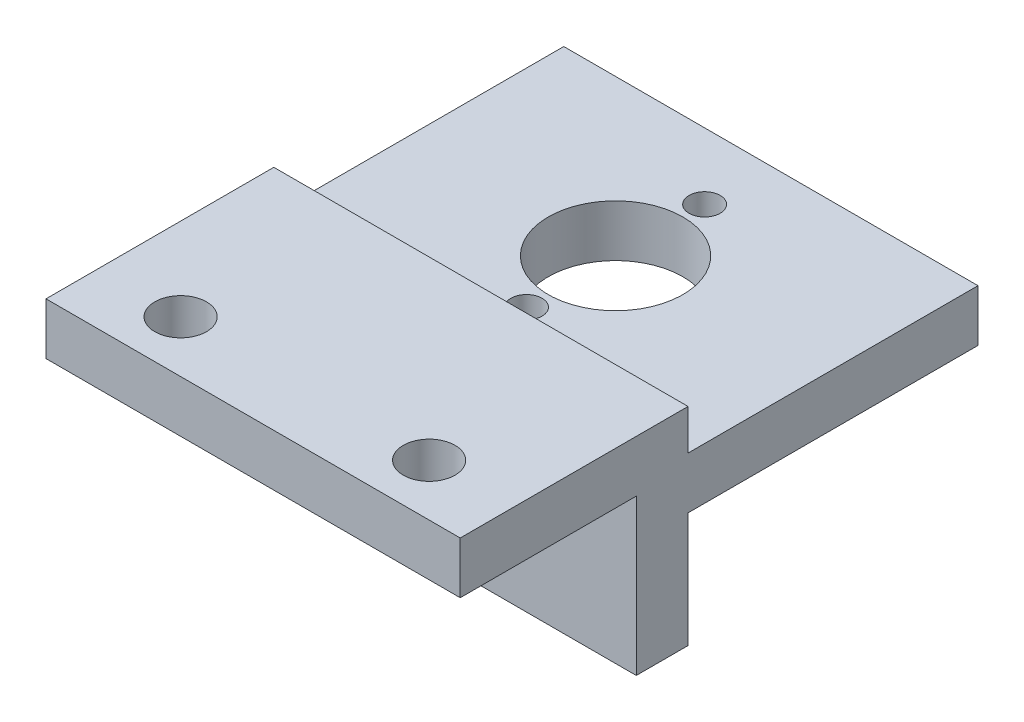
ISO-10303-21;
HEADER;
FILE_DESCRIPTION(('STEP AP214'),'2;1');
FILE_NAME('part.step','',(''),(''),'','','');
FILE_SCHEMA(('AUTOMOTIVE_DESIGN { 1 0 10303 214 1 1 1 1 }'));
ENDSEC;
DATA;
#1=APPLICATION_CONTEXT('core data for automotive mechanical design processes');
#2=APPLICATION_PROTOCOL_DEFINITION('international standard','automotive_design',2000,#1);
#3=PRODUCT_CONTEXT('',#1,'mechanical');
#4=PRODUCT('Part','Part','',(#3));
#5=PRODUCT_RELATED_PRODUCT_CATEGORY('part','',(#4));
#6=PRODUCT_DEFINITION_FORMATION('','',#4);
#7=PRODUCT_DEFINITION_CONTEXT('part definition',#1,'design');
#8=PRODUCT_DEFINITION('design','',#6,#7);
#9=PRODUCT_DEFINITION_SHAPE('','',#8);
#10=(LENGTH_UNIT() NAMED_UNIT(*) SI_UNIT(.MILLI.,.METRE.));
#11=(NAMED_UNIT(*) PLANE_ANGLE_UNIT() SI_UNIT($,.RADIAN.));
#12=(NAMED_UNIT(*) SI_UNIT($,.STERADIAN.) SOLID_ANGLE_UNIT());
#13=UNCERTAINTY_MEASURE_WITH_UNIT(LENGTH_MEASURE(1.E-05),#10,'distance_accuracy_value','');
#14=(GEOMETRIC_REPRESENTATION_CONTEXT(3) GLOBAL_UNCERTAINTY_ASSIGNED_CONTEXT((#13)) GLOBAL_UNIT_ASSIGNED_CONTEXT((#10,
#11,#12)) REPRESENTATION_CONTEXT('',''));
#15=CARTESIAN_POINT('',(0.,0.,0.));
#16=DIRECTION('',(0.,0.,1.));
#17=DIRECTION('',(1.,0.,0.));
#18=AXIS2_PLACEMENT_3D('',#15,#16,#17);
#19=CARTESIAN_POINT('',(0.,0.,0.));
#20=DIRECTION('',(0.,1.,0.));
#21=DIRECTION('',(0.,0.,1.));
#22=AXIS2_PLACEMENT_3D('',#19,#20,#21);
#23=PLANE('',#22);
#24=CARTESIAN_POINT('',(-12.,0.,30.));
#25=DIRECTION('',(0.,1.,0.));
#26=DIRECTION('',(0.,0.,1.));
#27=AXIS2_PLACEMENT_3D('',#24,#25,#26);
#28=CIRCLE('',#27,2.5);
#29=CARTESIAN_POINT('',(-12.,0.,32.5));
#30=VERTEX_POINT('',#29);
#31=EDGE_CURVE('E221',#30,#30,#28,.T.);
#32=ORIENTED_EDGE('',*,*,#31,.T.);
#33=EDGE_LOOP('',(#32));
#34=FACE_BOUND('',#33,.T.);
#35=CARTESIAN_POINT('',(12.,0.,30.));
#36=DIRECTION('',(0.,1.,0.));
#37=DIRECTION('',(0.,0.,1.));
#38=AXIS2_PLACEMENT_3D('',#35,#36,#37);
#39=CIRCLE('',#38,2.5);
#40=CARTESIAN_POINT('',(12.,0.,32.5));
#41=VERTEX_POINT('',#40);
#42=EDGE_CURVE('E225',#41,#41,#39,.T.);
#43=ORIENTED_EDGE('',*,*,#42,.T.);
#44=EDGE_LOOP('',(#43));
#45=FACE_BOUND('',#44,.T.);
#46=DIRECTION('',(-1.,0.,0.));
#47=VECTOR('',#46,1.);
#48=CARTESIAN_POINT('',(20.,0.,18.));
#49=LINE('',#48,#47);
#50=CARTESIAN_POINT('',(20.,0.,18.));
#51=VERTEX_POINT('',#50);
#52=CARTESIAN_POINT('',(-20.,0.,18.));
#53=VERTEX_POINT('',#52);
#54=EDGE_CURVE('E212',#51,#53,#49,.T.);
#55=ORIENTED_EDGE('',*,*,#54,.F.);
#56=DIRECTION('',(0.,0.,-1.));
#57=VECTOR('',#56,1.);
#58=CARTESIAN_POINT('',(20.,0.,-15.));
#59=LINE('',#58,#57);
#60=CARTESIAN_POINT('',(20.,0.,35.));
#61=VERTEX_POINT('',#60);
#62=EDGE_CURVE('E141',#61,#51,#59,.T.);
#63=ORIENTED_EDGE('',*,*,#62,.F.);
#64=DIRECTION('',(1.,0.,0.));
#65=VECTOR('',#64,1.);
#66=CARTESIAN_POINT('',(-20.,0.,35.));
#67=LINE('',#66,#65);
#68=CARTESIAN_POINT('',(-20.,0.,35.));
#69=VERTEX_POINT('',#68);
#70=EDGE_CURVE('E200',#69,#61,#67,.T.);
#71=ORIENTED_EDGE('',*,*,#70,.F.);
#72=DIRECTION('',(0.,0.,1.));
#73=VECTOR('',#72,1.);
#74=CARTESIAN_POINT('',(-20.,0.,-15.));
#75=LINE('',#74,#73);
#76=EDGE_CURVE('E206',#53,#69,#75,.T.);
#77=ORIENTED_EDGE('',*,*,#76,.F.);
#78=EDGE_LOOP('',(#55,#63,#71,#77));
#79=FACE_BOUND('',#78,.T.);
#80=ADVANCED_FACE('F32',(#34,#45,#79),#23,.F.);
#81=CARTESIAN_POINT('',(-20.,5.,-15.));
#82=DIRECTION('',(1.,0.,0.));
#83=DIRECTION('',(0.,0.,-1.));
#84=AXIS2_PLACEMENT_3D('',#81,#82,#83);
#85=PLANE('',#84);
#86=DIRECTION('',(0.,0.,1.));
#87=VECTOR('',#86,1.);
#88=CARTESIAN_POINT('',(-20.,5.,-15.));
#89=LINE('',#88,#87);
#90=CARTESIAN_POINT('',(-20.,5.,13.));
#91=VERTEX_POINT('',#90);
#92=CARTESIAN_POINT('',(-20.,5.,35.));
#93=VERTEX_POINT('',#92);
#94=EDGE_CURVE('E213',#91,#93,#89,.T.);
#95=ORIENTED_EDGE('',*,*,#94,.F.);
#96=DIRECTION('',(0.,1.,0.));
#97=VECTOR('',#96,1.);
#98=CARTESIAN_POINT('',(-20.,5.,13.));
#99=LINE('',#98,#97);
#100=CARTESIAN_POINT('',(-20.,1.1,13.));
#101=VERTEX_POINT('',#100);
#102=EDGE_CURVE('E49',#101,#91,#99,.T.);
#103=ORIENTED_EDGE('',*,*,#102,.F.);
#104=DIRECTION('',(0.,0.,1.));
#105=VECTOR('',#104,1.);
#106=CARTESIAN_POINT('',(-20.,1.1,-15.));
#107=LINE('',#106,#105);
#108=CARTESIAN_POINT('',(-20.,1.1,-15.));
#109=VERTEX_POINT('',#108);
#110=EDGE_CURVE('E116',#109,#101,#107,.T.);
#111=ORIENTED_EDGE('',*,*,#110,.F.);
#112=DIRECTION('',(0.,-1.,0.));
#113=VECTOR('',#112,1.);
#114=CARTESIAN_POINT('',(-20.,5.,-15.));
#115=LINE('',#114,#113);
#116=CARTESIAN_POINT('',(-20.,-3.9,-15.));
#117=VERTEX_POINT('',#116);
#118=EDGE_CURVE('E127',#109,#117,#115,.T.);
#119=ORIENTED_EDGE('',*,*,#118,.T.);
#120=DIRECTION('',(0.,0.,-1.));
#121=VECTOR('',#120,1.);
#122=CARTESIAN_POINT('',(-20.,-3.9,13.));
#123=LINE('',#122,#121);
#124=CARTESIAN_POINT('',(-20.,-3.9,13.));
#125=VERTEX_POINT('',#124);
#126=EDGE_CURVE('E149',#125,#117,#123,.T.);
#127=ORIENTED_EDGE('',*,*,#126,.F.);
#128=DIRECTION('',(0.,1.,0.));
#129=VECTOR('',#128,1.);
#130=CARTESIAN_POINT('',(-20.,-15.,13.));
#131=LINE('',#130,#129);
#132=CARTESIAN_POINT('',(-20.,-15.,13.));
#133=VERTEX_POINT('',#132);
#134=EDGE_CURVE('E236',#133,#125,#131,.T.);
#135=ORIENTED_EDGE('',*,*,#134,.F.);
#136=DIRECTION('',(0.,0.,-1.));
#137=VECTOR('',#136,1.);
#138=CARTESIAN_POINT('',(-20.,-15.,18.));
#139=LINE('',#138,#137);
#140=CARTESIAN_POINT('',(-20.,-15.,18.));
#141=VERTEX_POINT('',#140);
#142=EDGE_CURVE('E247',#141,#133,#139,.T.);
#143=ORIENTED_EDGE('',*,*,#142,.F.);
#144=DIRECTION('',(0.,1.,0.));
#145=VECTOR('',#144,1.);
#146=CARTESIAN_POINT('',(-20.,-15.,18.));
#147=LINE('',#146,#145);
#148=EDGE_CURVE('E234',#141,#53,#147,.T.);
#149=ORIENTED_EDGE('',*,*,#148,.T.);
#150=ORIENTED_EDGE('',*,*,#76,.T.);
#151=DIRECTION('',(0.,-1.,0.));
#152=VECTOR('',#151,1.);
#153=CARTESIAN_POINT('',(-20.,5.,35.));
#154=LINE('',#153,#152);
#155=EDGE_CURVE('E11',#93,#69,#154,.T.);
#156=ORIENTED_EDGE('',*,*,#155,.F.);
#157=EDGE_LOOP('',(#95,#103,#111,#119,#127,#135,#143,#149,#150,#156));
#158=FACE_BOUND('',#157,.T.);
#159=ADVANCED_FACE('F34',(#158),#85,.F.);
#160=CARTESIAN_POINT('',(-20.,5.,35.));
#161=DIRECTION('',(0.,0.,-1.));
#162=DIRECTION('',(-1.,0.,0.));
#163=AXIS2_PLACEMENT_3D('',#160,#161,#162);
#164=PLANE('',#163);
#165=ORIENTED_EDGE('',*,*,#70,.T.);
#166=DIRECTION('',(0.,-1.,0.));
#167=VECTOR('',#166,1.);
#168=CARTESIAN_POINT('',(20.,5.,35.));
#169=LINE('',#168,#167);
#170=CARTESIAN_POINT('',(20.,5.,35.));
#171=VERTEX_POINT('',#170);
#172=EDGE_CURVE('E41',#171,#61,#169,.T.);
#173=ORIENTED_EDGE('',*,*,#172,.F.);
#174=DIRECTION('',(1.,0.,0.));
#175=VECTOR('',#174,1.);
#176=CARTESIAN_POINT('',(-20.,5.,35.));
#177=LINE('',#176,#175);
#178=EDGE_CURVE('E138',#93,#171,#177,.T.);
#179=ORIENTED_EDGE('',*,*,#178,.F.);
#180=ORIENTED_EDGE('',*,*,#155,.T.);
#181=EDGE_LOOP('',(#165,#173,#179,#180));
#182=FACE_BOUND('',#181,.T.);
#183=ADVANCED_FACE('F182',(#182),#164,.F.);
#184=CARTESIAN_POINT('',(20.,5.,-15.));
#185=DIRECTION('',(-1.,0.,0.));
#186=DIRECTION('',(0.,0.,1.));
#187=AXIS2_PLACEMENT_3D('',#184,#185,#186);
#188=PLANE('',#187);
#189=DIRECTION('',(0.,0.,-1.));
#190=VECTOR('',#189,1.);
#191=CARTESIAN_POINT('',(20.,1.1,-15.));
#192=LINE('',#191,#190);
#193=CARTESIAN_POINT('',(20.,1.1,13.));
#194=VERTEX_POINT('',#193);
#195=CARTESIAN_POINT('',(20.,1.1,-15.));
#196=VERTEX_POINT('',#195);
#197=EDGE_CURVE('E118',#194,#196,#192,.T.);
#198=ORIENTED_EDGE('',*,*,#197,.F.);
#199=DIRECTION('',(0.,-1.,0.));
#200=VECTOR('',#199,1.);
#201=CARTESIAN_POINT('',(20.,5.,13.));
#202=LINE('',#201,#200);
#203=CARTESIAN_POINT('',(20.,5.,13.));
#204=VERTEX_POINT('',#203);
#205=EDGE_CURVE('E262',#204,#194,#202,.T.);
#206=ORIENTED_EDGE('',*,*,#205,.F.);
#207=DIRECTION('',(0.,0.,-1.));
#208=VECTOR('',#207,1.);
#209=CARTESIAN_POINT('',(20.,5.,-15.));
#210=LINE('',#209,#208);
#211=EDGE_CURVE('E134',#171,#204,#210,.T.);
#212=ORIENTED_EDGE('',*,*,#211,.F.);
#213=ORIENTED_EDGE('',*,*,#172,.T.);
#214=ORIENTED_EDGE('',*,*,#62,.T.);
#215=DIRECTION('',(0.,1.,0.));
#216=VECTOR('',#215,1.);
#217=CARTESIAN_POINT('',(20.,-15.,18.));
#218=LINE('',#217,#216);
#219=CARTESIAN_POINT('',(20.,-15.,18.));
#220=VERTEX_POINT('',#219);
#221=EDGE_CURVE('E230',#220,#51,#218,.T.);
#222=ORIENTED_EDGE('',*,*,#221,.F.);
#223=DIRECTION('',(0.,0.,1.));
#224=VECTOR('',#223,1.);
#225=CARTESIAN_POINT('',(20.,-15.,18.));
#226=LINE('',#225,#224);
#227=CARTESIAN_POINT('',(20.,-15.,13.));
#228=VERTEX_POINT('',#227);
#229=EDGE_CURVE('E244',#228,#220,#226,.T.);
#230=ORIENTED_EDGE('',*,*,#229,.F.);
#231=DIRECTION('',(0.,1.,0.));
#232=VECTOR('',#231,1.);
#233=CARTESIAN_POINT('',(20.,-15.,13.));
#234=LINE('',#233,#232);
#235=CARTESIAN_POINT('',(20.,-3.9,13.));
#236=VERTEX_POINT('',#235);
#237=EDGE_CURVE('E239',#228,#236,#234,.T.);
#238=ORIENTED_EDGE('',*,*,#237,.T.);
#239=DIRECTION('',(0.,0.,1.));
#240=VECTOR('',#239,1.);
#241=CARTESIAN_POINT('',(20.,-3.9,13.));
#242=LINE('',#241,#240);
#243=CARTESIAN_POINT('',(20.,-3.9,-15.));
#244=VERTEX_POINT('',#243);
#245=EDGE_CURVE('E57',#244,#236,#242,.T.);
#246=ORIENTED_EDGE('',*,*,#245,.F.);
#247=DIRECTION('',(0.,-1.,0.));
#248=VECTOR('',#247,1.);
#249=CARTESIAN_POINT('',(20.,5.,-15.));
#250=LINE('',#249,#248);
#251=EDGE_CURVE('E133',#196,#244,#250,.T.);
#252=ORIENTED_EDGE('',*,*,#251,.F.);
#253=EDGE_LOOP('',(#198,#206,#212,#213,#214,#222,#230,#238,#246,#252));
#254=FACE_BOUND('',#253,.T.);
#255=ADVANCED_FACE('F191',(#254),#188,.F.);
#256=CARTESIAN_POINT('',(-20.,5.,-15.));
#257=DIRECTION('',(0.,0.,1.));
#258=DIRECTION('',(1.,0.,0.));
#259=AXIS2_PLACEMENT_3D('',#256,#257,#258);
#260=PLANE('',#259);
#261=ORIENTED_EDGE('',*,*,#118,.F.);
#262=DIRECTION('',(-1.,0.,0.));
#263=VECTOR('',#262,1.);
#264=CARTESIAN_POINT('',(48.2703024391321,1.1,-15.));
#265=LINE('',#264,#263);
#266=EDGE_CURVE('E112',#196,#109,#265,.T.);
#267=ORIENTED_EDGE('',*,*,#266,.F.);
#268=ORIENTED_EDGE('',*,*,#251,.T.);
#269=DIRECTION('',(1.,0.,0.));
#270=VECTOR('',#269,1.);
#271=CARTESIAN_POINT('',(-20.,-3.9,-15.));
#272=LINE('',#271,#270);
#273=EDGE_CURVE('E131',#117,#244,#272,.T.);
#274=ORIENTED_EDGE('',*,*,#273,.F.);
#275=EDGE_LOOP('',(#261,#267,#268,#274));
#276=FACE_BOUND('',#275,.T.);
#277=ADVANCED_FACE('F130',(#276),#260,.F.);
#278=CARTESIAN_POINT('',(0.,5.,0.));
#279=DIRECTION('',(0.,1.,0.));
#280=DIRECTION('',(0.,0.,1.));
#281=AXIS2_PLACEMENT_3D('',#278,#279,#280);
#282=PLANE('',#281);
#283=DIRECTION('',(-1.,0.,0.));
#284=VECTOR('',#283,1.);
#285=CARTESIAN_POINT('',(48.2703024391321,5.,13.));
#286=LINE('',#285,#284);
#287=EDGE_CURVE('E265',#204,#91,#286,.T.);
#288=ORIENTED_EDGE('',*,*,#287,.T.);
#289=ORIENTED_EDGE('',*,*,#94,.T.);
#290=ORIENTED_EDGE('',*,*,#178,.T.);
#291=ORIENTED_EDGE('',*,*,#211,.T.);
#292=EDGE_LOOP('',(#288,#289,#290,#291));
#293=FACE_BOUND('',#292,.T.);
#294=CARTESIAN_POINT('',(12.,5.,30.));
#295=DIRECTION('',(0.,1.,0.));
#296=DIRECTION('',(0.,0.,1.));
#297=AXIS2_PLACEMENT_3D('',#294,#295,#296);
#298=CIRCLE('',#297,2.5);
#299=CARTESIAN_POINT('',(12.,5.,32.5));
#300=VERTEX_POINT('',#299);
#301=EDGE_CURVE('E227',#300,#300,#298,.T.);
#302=ORIENTED_EDGE('',*,*,#301,.F.);
#303=EDGE_LOOP('',(#302));
#304=FACE_BOUND('',#303,.T.);
#305=CARTESIAN_POINT('',(-12.,5.,30.));
#306=DIRECTION('',(0.,1.,0.));
#307=DIRECTION('',(0.,0.,1.));
#308=AXIS2_PLACEMENT_3D('',#305,#306,#307);
#309=CIRCLE('',#308,2.5);
#310=CARTESIAN_POINT('',(-12.,5.,32.5));
#311=VERTEX_POINT('',#310);
#312=EDGE_CURVE('E218',#311,#311,#309,.T.);
#313=ORIENTED_EDGE('',*,*,#312,.F.);
#314=EDGE_LOOP('',(#313));
#315=FACE_BOUND('',#314,.T.);
#316=ADVANCED_FACE('F187',(#293,#304,#315),#282,.T.);
#317=CARTESIAN_POINT('',(-12.,0.,30.));
#318=DIRECTION('',(0.,1.,0.));
#319=DIRECTION('',(0.,0.,1.));
#320=AXIS2_PLACEMENT_3D('',#317,#318,#319);
#321=CYLINDRICAL_SURFACE('',#320,2.5);
#322=ORIENTED_EDGE('',*,*,#31,.F.);
#323=EDGE_LOOP('',(#322));
#324=FACE_BOUND('',#323,.T.);
#325=ORIENTED_EDGE('',*,*,#312,.T.);
#326=EDGE_LOOP('',(#325));
#327=FACE_BOUND('',#326,.T.);
#328=ADVANCED_FACE('F288',(#324,#327),#321,.F.);
#329=CARTESIAN_POINT('',(12.,0.,30.));
#330=DIRECTION('',(0.,1.,0.));
#331=DIRECTION('',(0.,0.,1.));
#332=AXIS2_PLACEMENT_3D('',#329,#330,#331);
#333=CYLINDRICAL_SURFACE('',#332,2.5);
#334=ORIENTED_EDGE('',*,*,#42,.F.);
#335=EDGE_LOOP('',(#334));
#336=FACE_BOUND('',#335,.T.);
#337=ORIENTED_EDGE('',*,*,#301,.T.);
#338=EDGE_LOOP('',(#337));
#339=FACE_BOUND('',#338,.T.);
#340=ADVANCED_FACE('F281',(#336,#339),#333,.F.);
#341=CARTESIAN_POINT('',(20.,-15.,18.));
#342=DIRECTION('',(0.,0.,-1.));
#343=DIRECTION('',(-1.,0.,0.));
#344=AXIS2_PLACEMENT_3D('',#341,#342,#343);
#345=PLANE('',#344);
#346=ORIENTED_EDGE('',*,*,#54,.T.);
#347=ORIENTED_EDGE('',*,*,#148,.F.);
#348=DIRECTION('',(-1.,0.,0.));
#349=VECTOR('',#348,1.);
#350=CARTESIAN_POINT('',(20.,-15.,18.));
#351=LINE('',#350,#349);
#352=EDGE_CURVE('E249',#220,#141,#351,.T.);
#353=ORIENTED_EDGE('',*,*,#352,.F.);
#354=ORIENTED_EDGE('',*,*,#221,.T.);
#355=EDGE_LOOP('',(#346,#347,#353,#354));
#356=FACE_BOUND('',#355,.T.);
#357=ADVANCED_FACE('F279',(#356),#345,.F.);
#358=CARTESIAN_POINT('',(20.,-15.,13.));
#359=DIRECTION('',(0.,0.,1.));
#360=DIRECTION('',(1.,0.,0.));
#361=AXIS2_PLACEMENT_3D('',#358,#359,#360);
#362=PLANE('',#361);
#363=ORIENTED_EDGE('',*,*,#134,.T.);
#364=DIRECTION('',(-1.,0.,0.));
#365=VECTOR('',#364,1.);
#366=CARTESIAN_POINT('',(-20.,-3.9,13.));
#367=LINE('',#366,#365);
#368=EDGE_CURVE('E245',#236,#125,#367,.T.);
#369=ORIENTED_EDGE('',*,*,#368,.F.);
#370=ORIENTED_EDGE('',*,*,#237,.F.);
#371=DIRECTION('',(1.,0.,0.));
#372=VECTOR('',#371,1.);
#373=CARTESIAN_POINT('',(20.,-15.,13.));
#374=LINE('',#373,#372);
#375=EDGE_CURVE('E242',#133,#228,#374,.T.);
#376=ORIENTED_EDGE('',*,*,#375,.F.);
#377=EDGE_LOOP('',(#363,#369,#370,#376));
#378=FACE_BOUND('',#377,.T.);
#379=ADVANCED_FACE('F272',(#378),#362,.F.);
#380=CARTESIAN_POINT('',(0.,-15.,0.));
#381=DIRECTION('',(0.,1.,0.));
#382=DIRECTION('',(0.,0.,1.));
#383=AXIS2_PLACEMENT_3D('',#380,#381,#382);
#384=PLANE('',#383);
#385=ORIENTED_EDGE('',*,*,#229,.T.);
#386=ORIENTED_EDGE('',*,*,#352,.T.);
#387=ORIENTED_EDGE('',*,*,#142,.T.);
#388=ORIENTED_EDGE('',*,*,#375,.T.);
#389=EDGE_LOOP('',(#385,#386,#387,#388));
#390=FACE_BOUND('',#389,.T.);
#391=ADVANCED_FACE('F276',(#390),#384,.F.);
#392=CARTESIAN_POINT('',(0.,-3.9,0.));
#393=DIRECTION('',(0.,-1.,0.));
#394=DIRECTION('',(0.,0.,-1.));
#395=AXIS2_PLACEMENT_3D('',#392,#393,#394);
#396=PLANE('',#395);
#397=CARTESIAN_POINT('',(0.,-3.9,-8.6));
#398=DIRECTION('',(0.,-1.,0.));
#399=DIRECTION('',(0.,0.,-1.));
#400=AXIS2_PLACEMENT_3D('',#397,#398,#399);
#401=CIRCLE('',#400,1.5);
#402=CARTESIAN_POINT('',(0.,-3.9,-10.1));
#403=VERTEX_POINT('',#402);
#404=EDGE_CURVE('E150',#403,#403,#401,.F.);
#405=ORIENTED_EDGE('',*,*,#404,.T.);
#406=EDGE_LOOP('',(#405));
#407=FACE_BOUND('',#406,.T.);
#408=CARTESIAN_POINT('',(0.,-3.9,8.6));
#409=DIRECTION('',(0.,-1.,0.));
#410=DIRECTION('',(0.,0.,-1.));
#411=AXIS2_PLACEMENT_3D('',#408,#409,#410);
#412=CIRCLE('',#411,1.5);
#413=CARTESIAN_POINT('',(0.,-3.9,7.1));
#414=VERTEX_POINT('',#413);
#415=EDGE_CURVE('E151',#414,#414,#412,.F.);
#416=ORIENTED_EDGE('',*,*,#415,.T.);
#417=EDGE_LOOP('',(#416));
#418=FACE_BOUND('',#417,.T.);
#419=CARTESIAN_POINT('',(0.,-3.9,0.));
#420=DIRECTION('',(0.,-1.,0.));
#421=DIRECTION('',(0.,0.,-1.));
#422=AXIS2_PLACEMENT_3D('',#419,#420,#421);
#423=CIRCLE('',#422,6.5);
#424=CARTESIAN_POINT('',(0.,-3.9,-6.5));
#425=VERTEX_POINT('',#424);
#426=EDGE_CURVE('E146',#425,#425,#423,.F.);
#427=ORIENTED_EDGE('',*,*,#426,.T.);
#428=EDGE_LOOP('',(#427));
#429=FACE_BOUND('',#428,.T.);
#430=ORIENTED_EDGE('',*,*,#126,.T.);
#431=ORIENTED_EDGE('',*,*,#273,.T.);
#432=ORIENTED_EDGE('',*,*,#245,.T.);
#433=ORIENTED_EDGE('',*,*,#368,.T.);
#434=EDGE_LOOP('',(#430,#431,#432,#433));
#435=FACE_BOUND('',#434,.T.);
#436=ADVANCED_FACE('F157',(#407,#418,#429,#435),#396,.T.);
#437=CARTESIAN_POINT('',(0.,5.,0.));
#438=DIRECTION('',(0.,-1.,0.));
#439=DIRECTION('',(0.,0.,-1.));
#440=AXIS2_PLACEMENT_3D('',#437,#438,#439);
#441=CYLINDRICAL_SURFACE('',#440,6.5);
#442=CARTESIAN_POINT('',(0.,1.1,0.));
#443=DIRECTION('',(0.,-1.,0.));
#444=DIRECTION('',(0.,0.,-1.));
#445=AXIS2_PLACEMENT_3D('',#442,#443,#444);
#446=CIRCLE('',#445,6.5);
#447=CARTESIAN_POINT('',(0.,1.1,-6.5));
#448=VERTEX_POINT('',#447);
#449=EDGE_CURVE('E153',#448,#448,#446,.T.);
#450=ORIENTED_EDGE('',*,*,#449,.F.);
#451=EDGE_LOOP('',(#450));
#452=FACE_BOUND('',#451,.T.);
#453=ORIENTED_EDGE('',*,*,#426,.F.);
#454=EDGE_LOOP('',(#453));
#455=FACE_BOUND('',#454,.T.);
#456=ADVANCED_FACE('F171',(#452,#455),#441,.F.);
#457=CARTESIAN_POINT('',(0.,5.,8.6));
#458=DIRECTION('',(0.,-1.,0.));
#459=DIRECTION('',(0.,0.,-1.));
#460=AXIS2_PLACEMENT_3D('',#457,#458,#459);
#461=CYLINDRICAL_SURFACE('',#460,1.5);
#462=CARTESIAN_POINT('',(0.,1.1,8.6));
#463=DIRECTION('',(0.,-1.,0.));
#464=DIRECTION('',(0.,0.,-1.));
#465=AXIS2_PLACEMENT_3D('',#462,#463,#464);
#466=CIRCLE('',#465,1.5);
#467=CARTESIAN_POINT('',(0.,1.1,7.1));
#468=VERTEX_POINT('',#467);
#469=EDGE_CURVE('E259',#468,#468,#466,.T.);
#470=ORIENTED_EDGE('',*,*,#469,.F.);
#471=EDGE_LOOP('',(#470));
#472=FACE_BOUND('',#471,.T.);
#473=ORIENTED_EDGE('',*,*,#415,.F.);
#474=EDGE_LOOP('',(#473));
#475=FACE_BOUND('',#474,.T.);
#476=ADVANCED_FACE('F163',(#472,#475),#461,.F.);
#477=CARTESIAN_POINT('',(0.,5.,-8.6));
#478=DIRECTION('',(0.,-1.,0.));
#479=DIRECTION('',(0.,0.,-1.));
#480=AXIS2_PLACEMENT_3D('',#477,#478,#479);
#481=CYLINDRICAL_SURFACE('',#480,1.5);
#482=CARTESIAN_POINT('',(0.,1.1,-8.6));
#483=DIRECTION('',(0.,-1.,0.));
#484=DIRECTION('',(0.,0.,-1.));
#485=AXIS2_PLACEMENT_3D('',#482,#483,#484);
#486=CIRCLE('',#485,1.5);
#487=CARTESIAN_POINT('',(0.,1.1,-10.1));
#488=VERTEX_POINT('',#487);
#489=EDGE_CURVE('E36',#488,#488,#486,.T.);
#490=ORIENTED_EDGE('',*,*,#489,.F.);
#491=EDGE_LOOP('',(#490));
#492=FACE_BOUND('',#491,.T.);
#493=ORIENTED_EDGE('',*,*,#404,.F.);
#494=EDGE_LOOP('',(#493));
#495=FACE_BOUND('',#494,.T.);
#496=ADVANCED_FACE('F160',(#492,#495),#481,.F.);
#497=CARTESIAN_POINT('',(48.2703024391321,5.,13.));
#498=DIRECTION('',(0.,0.,1.));
#499=DIRECTION('',(1.,0.,0.));
#500=AXIS2_PLACEMENT_3D('',#497,#498,#499);
#501=PLANE('',#500);
#502=ORIENTED_EDGE('',*,*,#205,.T.);
#503=DIRECTION('',(-1.,0.,0.));
#504=VECTOR('',#503,1.);
#505=CARTESIAN_POINT('',(48.2703024391321,1.1,13.));
#506=LINE('',#505,#504);
#507=EDGE_CURVE('E122',#194,#101,#506,.T.);
#508=ORIENTED_EDGE('',*,*,#507,.T.);
#509=ORIENTED_EDGE('',*,*,#102,.T.);
#510=ORIENTED_EDGE('',*,*,#287,.F.);
#511=EDGE_LOOP('',(#502,#508,#509,#510));
#512=FACE_BOUND('',#511,.T.);
#513=ADVANCED_FACE('F162',(#512),#501,.F.);
#514=CARTESIAN_POINT('',(48.2703024391321,1.1,-15.));
#515=DIRECTION('',(0.,-1.,0.));
#516=DIRECTION('',(0.,0.,-1.));
#517=AXIS2_PLACEMENT_3D('',#514,#515,#516);
#518=PLANE('',#517);
#519=ORIENTED_EDGE('',*,*,#449,.T.);
#520=EDGE_LOOP('',(#519));
#521=FACE_BOUND('',#520,.T.);
#522=ORIENTED_EDGE('',*,*,#469,.T.);
#523=EDGE_LOOP('',(#522));
#524=FACE_BOUND('',#523,.T.);
#525=ORIENTED_EDGE('',*,*,#489,.T.);
#526=EDGE_LOOP('',(#525));
#527=FACE_BOUND('',#526,.T.);
#528=ORIENTED_EDGE('',*,*,#197,.T.);
#529=ORIENTED_EDGE('',*,*,#266,.T.);
#530=ORIENTED_EDGE('',*,*,#110,.T.);
#531=ORIENTED_EDGE('',*,*,#507,.F.);
#532=EDGE_LOOP('',(#528,#529,#530,#531));
#533=FACE_BOUND('',#532,.T.);
#534=ADVANCED_FACE('F114',(#521,#524,#527,#533),#518,.F.);
#535=CLOSED_SHELL('',(#80,#159,#183,#255,#277,#316,#328,#340,#357,#379,#391,#436,#456,#476,#496,
#513,#534));
#536=MANIFOLD_SOLID_BREP('B2',#535);
#537=ADVANCED_BREP_SHAPE_REPRESENTATION('',(#18,#536),#14);
#538=SHAPE_DEFINITION_REPRESENTATION(#9,#537);
ENDSEC;
END-ISO-10303-21;
